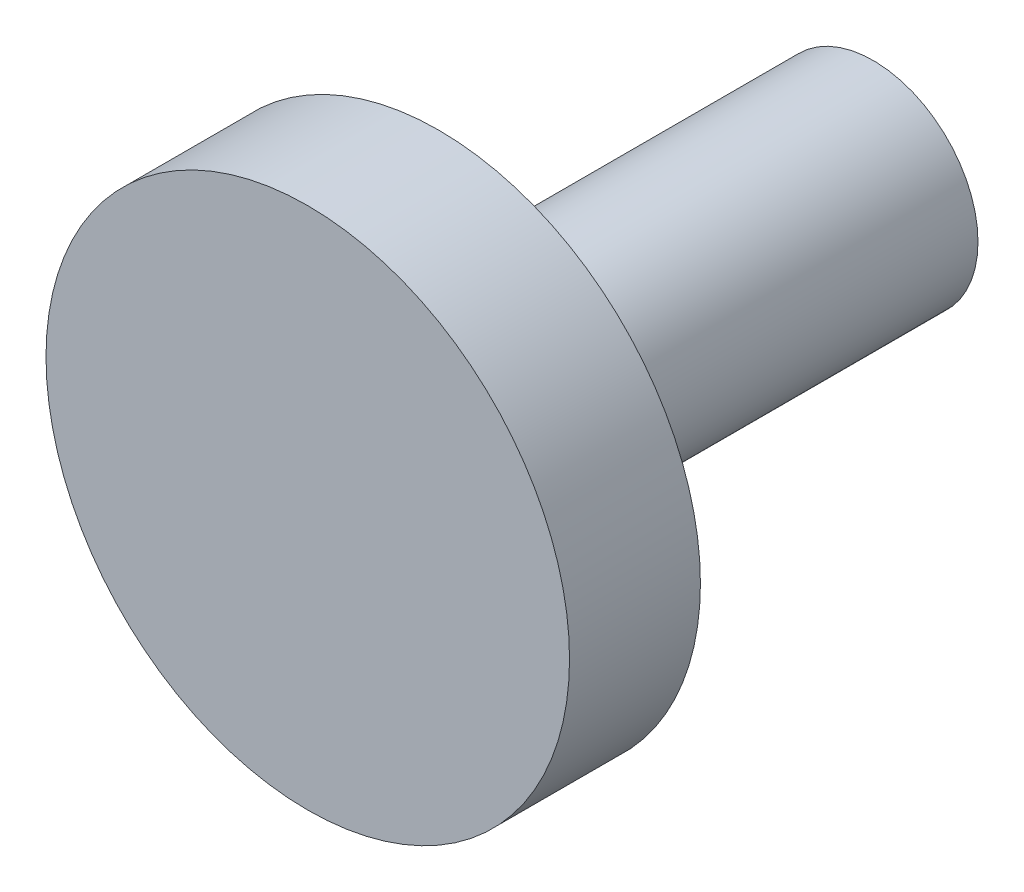
ISO-10303-21;
HEADER;
FILE_DESCRIPTION(('STEP AP214'),'2;1');
FILE_NAME('part.step','',(''),(''),'','','');
FILE_SCHEMA(('AUTOMOTIVE_DESIGN { 1 0 10303 214 1 1 1 1 }'));
ENDSEC;
DATA;
#1=APPLICATION_CONTEXT('core data for automotive mechanical design processes');
#2=APPLICATION_PROTOCOL_DEFINITION('international standard','automotive_design',2000,#1);
#3=PRODUCT_CONTEXT('',#1,'mechanical');
#4=PRODUCT('Part','Part','',(#3));
#5=PRODUCT_RELATED_PRODUCT_CATEGORY('part','',(#4));
#6=PRODUCT_DEFINITION_FORMATION('','',#4);
#7=PRODUCT_DEFINITION_CONTEXT('part definition',#1,'design');
#8=PRODUCT_DEFINITION('design','',#6,#7);
#9=PRODUCT_DEFINITION_SHAPE('','',#8);
#10=(LENGTH_UNIT() NAMED_UNIT(*) SI_UNIT(.MILLI.,.METRE.));
#11=(NAMED_UNIT(*) PLANE_ANGLE_UNIT() SI_UNIT($,.RADIAN.));
#12=(NAMED_UNIT(*) SI_UNIT($,.STERADIAN.) SOLID_ANGLE_UNIT());
#13=UNCERTAINTY_MEASURE_WITH_UNIT(LENGTH_MEASURE(1.E-05),#10,'distance_accuracy_value','');
#14=(GEOMETRIC_REPRESENTATION_CONTEXT(3) GLOBAL_UNCERTAINTY_ASSIGNED_CONTEXT((#13)) GLOBAL_UNIT_ASSIGNED_CONTEXT((#10,
#11,#12)) REPRESENTATION_CONTEXT('',''));
#15=CARTESIAN_POINT('',(0.,0.,0.));
#16=DIRECTION('',(0.,0.,1.));
#17=DIRECTION('',(1.,0.,0.));
#18=AXIS2_PLACEMENT_3D('',#15,#16,#17);
#19=CARTESIAN_POINT('',(-385.445,317.5,-150.293834653373));
#20=DIRECTION('',(0.,0.,1.));
#21=DIRECTION('',(1.,0.,0.));
#22=AXIS2_PLACEMENT_3D('',#19,#20,#21);
#23=PLANE('',#22);
#24=CARTESIAN_POINT('',(-385.445,317.5,-150.293834653373));
#25=DIRECTION('',(0.,0.,1.));
#26=DIRECTION('',(1.,0.,0.));
#27=AXIS2_PLACEMENT_3D('',#24,#25,#26);
#28=CIRCLE('',#27,38.1);
#29=CARTESIAN_POINT('',(-423.545,317.5,-150.293834653373));
#30=VERTEX_POINT('',#29);
#31=EDGE_CURVE('E39',#30,#30,#28,.T.);
#32=ORIENTED_EDGE('',*,*,#31,.T.);
#33=EDGE_LOOP('',(#32));
#34=FACE_BOUND('',#33,.T.);
#35=ADVANCED_FACE('F32',(#34),#23,.T.);
#36=CARTESIAN_POINT('',(-385.445,317.5,-150.293834653373));
#37=DIRECTION('',(0.,0.,-1.));
#38=DIRECTION('',(-1.,0.,0.));
#39=AXIS2_PLACEMENT_3D('',#36,#37,#38);
#40=CYLINDRICAL_SURFACE('',#39,38.1);
#41=CARTESIAN_POINT('',(-385.445,317.5,-169.343834653373));
#42=DIRECTION('',(0.,0.,1.));
#43=DIRECTION('',(1.,0.,0.));
#44=AXIS2_PLACEMENT_3D('',#41,#42,#43);
#45=CIRCLE('',#44,38.1);
#46=CARTESIAN_POINT('',(-423.545,317.5,-169.343834653373));
#47=VERTEX_POINT('',#46);
#48=EDGE_CURVE('E44',#47,#47,#45,.T.);
#49=CARTESIAN_POINT('',(-423.545,317.5,-150.293834653373));
#50=CARTESIAN_POINT('',(-423.545,317.5,-150.492272153373));
#51=CARTESIAN_POINT('',(-423.545,317.5,-150.690709653373));
#52=CARTESIAN_POINT('',(-423.545,317.5,-151.087584653373));
#53=CARTESIAN_POINT('',(-423.545,317.5,-151.286022153373));
#54=CARTESIAN_POINT('',(-423.545,317.5,-151.682897153373));
#55=CARTESIAN_POINT('',(-423.545,317.5,-151.881334653373));
#56=CARTESIAN_POINT('',(-423.545,317.5,-152.278209653373));
#57=CARTESIAN_POINT('',(-423.545,317.5,-152.476647153373));
#58=CARTESIAN_POINT('',(-423.545,317.5,-152.873522153373));
#59=CARTESIAN_POINT('',(-423.545,317.5,-153.071959653373));
#60=CARTESIAN_POINT('',(-423.545,317.5,-153.468834653373));
#61=CARTESIAN_POINT('',(-423.545,317.5,-153.667272153373));
#62=CARTESIAN_POINT('',(-423.545,317.5,-154.064147153373));
#63=CARTESIAN_POINT('',(-423.545,317.5,-154.262584653373));
#64=CARTESIAN_POINT('',(-423.545,317.5,-154.659459653373));
#65=CARTESIAN_POINT('',(-423.545,317.5,-154.857897153373));
#66=CARTESIAN_POINT('',(-423.545,317.5,-155.254772153373));
#67=CARTESIAN_POINT('',(-423.545,317.5,-155.453209653373));
#68=CARTESIAN_POINT('',(-423.545,317.5,-155.850084653373));
#69=CARTESIAN_POINT('',(-423.545,317.5,-156.048522153373));
#70=CARTESIAN_POINT('',(-423.545,317.5,-156.445397153373));
#71=CARTESIAN_POINT('',(-423.545,317.5,-156.643834653373));
#72=CARTESIAN_POINT('',(-423.545,317.5,-157.040709653373));
#73=CARTESIAN_POINT('',(-423.545,317.5,-157.239147153373));
#74=CARTESIAN_POINT('',(-423.545,317.5,-157.636022153373));
#75=CARTESIAN_POINT('',(-423.545,317.5,-157.834459653373));
#76=CARTESIAN_POINT('',(-423.545,317.5,-158.231334653373));
#77=CARTESIAN_POINT('',(-423.545,317.5,-158.429772153373));
#78=CARTESIAN_POINT('',(-423.545,317.5,-158.826647153373));
#79=CARTESIAN_POINT('',(-423.545,317.5,-159.025084653373));
#80=CARTESIAN_POINT('',(-423.545,317.5,-159.421959653373));
#81=CARTESIAN_POINT('',(-423.545,317.5,-159.620397153373));
#82=CARTESIAN_POINT('',(-423.545,317.5,-160.017272153373));
#83=CARTESIAN_POINT('',(-423.545,317.5,-160.215709653373));
#84=CARTESIAN_POINT('',(-423.545,317.5,-160.612584653373));
#85=CARTESIAN_POINT('',(-423.545,317.5,-160.811022153373));
#86=CARTESIAN_POINT('',(-423.545,317.5,-161.207897153373));
#87=CARTESIAN_POINT('',(-423.545,317.5,-161.406334653373));
#88=CARTESIAN_POINT('',(-423.545,317.5,-161.803209653373));
#89=CARTESIAN_POINT('',(-423.545,317.5,-162.001647153373));
#90=CARTESIAN_POINT('',(-423.545,317.5,-162.398522153373));
#91=CARTESIAN_POINT('',(-423.545,317.5,-162.596959653373));
#92=CARTESIAN_POINT('',(-423.545,317.5,-162.993834653373));
#93=CARTESIAN_POINT('',(-423.545,317.5,-163.192272153373));
#94=CARTESIAN_POINT('',(-423.545,317.5,-163.589147153373));
#95=CARTESIAN_POINT('',(-423.545,317.5,-163.787584653373));
#96=CARTESIAN_POINT('',(-423.545,317.5,-164.184459653373));
#97=CARTESIAN_POINT('',(-423.545,317.5,-164.382897153373));
#98=CARTESIAN_POINT('',(-423.545,317.5,-164.779772153373));
#99=CARTESIAN_POINT('',(-423.545,317.5,-164.978209653373));
#100=CARTESIAN_POINT('',(-423.545,317.5,-165.375084653373));
#101=CARTESIAN_POINT('',(-423.545,317.5,-165.573522153373));
#102=CARTESIAN_POINT('',(-423.545,317.5,-165.970397153373));
#103=CARTESIAN_POINT('',(-423.545,317.5,-166.168834653373));
#104=CARTESIAN_POINT('',(-423.545,317.5,-166.565709653373));
#105=CARTESIAN_POINT('',(-423.545,317.5,-166.764147153373));
#106=CARTESIAN_POINT('',(-423.545,317.5,-167.161022153373));
#107=CARTESIAN_POINT('',(-423.545,317.5,-167.359459653373));
#108=CARTESIAN_POINT('',(-423.545,317.5,-167.756334653373));
#109=CARTESIAN_POINT('',(-423.545,317.5,-167.954772153373));
#110=CARTESIAN_POINT('',(-423.545,317.5,-168.351647153373));
#111=CARTESIAN_POINT('',(-423.545,317.5,-168.550084653373));
#112=CARTESIAN_POINT('',(-423.545,317.5,-168.946959653373));
#113=CARTESIAN_POINT('',(-423.545,317.5,-169.145397153373));
#114=CARTESIAN_POINT('',(-423.545,317.5,-169.343834653373));
#115=B_SPLINE_CURVE_WITH_KNOTS('',3,(#49,#50,#51,#52,#53,#54,#55,#56,#57,#58,#59,#60,#61,#62,
#63,#64,#65,#66,#67,#68,#69,#70,#71,#72,#73,#74,#75,#76,#77,#78,#79,#80,#81,#82,#83,#84,#85,#86,
#87,#88,#89,#90,#91,#92,#93,#94,#95,#96,#97,#98,#99,#100,#101,#102,#103,#104,#105,#106,#107,
#108,#109,#110,#111,#112,#113,#114),.UNSPECIFIED.,.F.,.F.,(4,2,2,2,2,2,2,2,2,2,2,2,2,2,2,2,2,2,
2,2,2,2,2,2,2,2,2,2,2,2,2,2,4),(0.,0.595312499999973,1.19062499999997,1.78593749999997,
2.38124999999997,2.97656249999997,3.57187499999997,4.16718749999997,4.76249999999998,
5.35781249999998,5.95312499999998,6.54843749999998,7.14374999999998,7.73906249999998,
8.33437499999998,8.92968749999998,9.52499999999998,10.1203125,10.715625,11.3109375,11.90625,
12.5015625,13.096875,13.6921875,14.2875,14.8828125,15.478125,16.0734375,16.66875,17.2640625,
17.859375,18.4546875,19.05),.UNSPECIFIED.);
#116=EDGE_CURVE('BSEAM64',#30,#47,#115,.T.);
#117=ORIENTED_EDGE('',*,*,#31,.F.);
#118=ORIENTED_EDGE('',*,*,#48,.T.);
#119=ORIENTED_EDGE('',*,*,#116,.T.);
#120=ORIENTED_EDGE('',*,*,#116,.F.);
#121=EDGE_LOOP('',(#117,#119,#118,#120));
#122=FACE_BOUND('',#121,.T.);
#123=ADVANCED_FACE('F64',(#122),#40,.T.);
#124=CARTESIAN_POINT('',(-385.445,317.5,-169.343834653373));
#125=DIRECTION('',(0.,0.,1.));
#126=DIRECTION('',(1.,0.,0.));
#127=AXIS2_PLACEMENT_3D('',#124,#125,#126);
#128=PLANE('',#127);
#129=CARTESIAN_POINT('',(-385.445,317.5,-169.343834653373));
#130=DIRECTION('',(0.,0.,1.));
#131=DIRECTION('',(1.,0.,0.));
#132=AXIS2_PLACEMENT_3D('',#129,#130,#131);
#133=CIRCLE('',#132,15.24);
#134=CARTESIAN_POINT('',(-370.205,317.5,-169.343834653373));
#135=VERTEX_POINT('',#134);
#136=EDGE_CURVE('E10',#135,#135,#133,.T.);
#137=ORIENTED_EDGE('',*,*,#136,.T.);
#138=EDGE_LOOP('',(#137));
#139=FACE_BOUND('',#138,.T.);
#140=ORIENTED_EDGE('',*,*,#48,.F.);
#141=EDGE_LOOP('',(#140));
#142=FACE_BOUND('',#141,.T.);
#143=ADVANCED_FACE('F61',(#139,#142),#128,.F.);
#144=CARTESIAN_POINT('',(-385.445,317.5,-169.343834653373));
#145=DIRECTION('',(0.,0.,-1.));
#146=DIRECTION('',(-1.,0.,0.));
#147=AXIS2_PLACEMENT_3D('',#144,#145,#146);
#148=CYLINDRICAL_SURFACE('',#147,15.24);
#149=CARTESIAN_POINT('',(-385.445,317.5,-232.604114516717));
#150=DIRECTION('',(0.,0.,1.));
#151=DIRECTION('',(1.,0.,0.));
#152=AXIS2_PLACEMENT_3D('',#149,#150,#151);
#153=CIRCLE('',#152,15.24);
#154=CARTESIAN_POINT('',(-370.205,317.5,-232.604114516717));
#155=VERTEX_POINT('',#154);
#156=EDGE_CURVE('E35',#155,#155,#153,.T.);
#157=ORIENTED_EDGE('',*,*,#156,.T.);
#158=EDGE_LOOP('',(#157));
#159=FACE_BOUND('',#158,.T.);
#160=ORIENTED_EDGE('',*,*,#136,.F.);
#161=EDGE_LOOP('',(#160));
#162=FACE_BOUND('',#161,.T.);
#163=ADVANCED_FACE('F52',(#159,#162),#148,.T.);
#164=CARTESIAN_POINT('',(-466.725,345.059193995819,-232.604114516717));
#165=DIRECTION('',(0.,0.,1.));
#166=DIRECTION('',(1.,0.,0.));
#167=AXIS2_PLACEMENT_3D('',#164,#165,#166);
#168=PLANE('',#167);
#169=ORIENTED_EDGE('',*,*,#156,.F.);
#170=EDGE_LOOP('',(#169));
#171=FACE_BOUND('',#170,.T.);
#172=ADVANCED_FACE('F55',(#171),#168,.F.);
#173=CLOSED_SHELL('',(#35,#123,#143,#163,#172));
#174=MANIFOLD_SOLID_BREP('B2',#173);
#175=ADVANCED_BREP_SHAPE_REPRESENTATION('',(#18,#174),#14);
#176=SHAPE_DEFINITION_REPRESENTATION(#9,#175);
ENDSEC;
END-ISO-10303-21;
